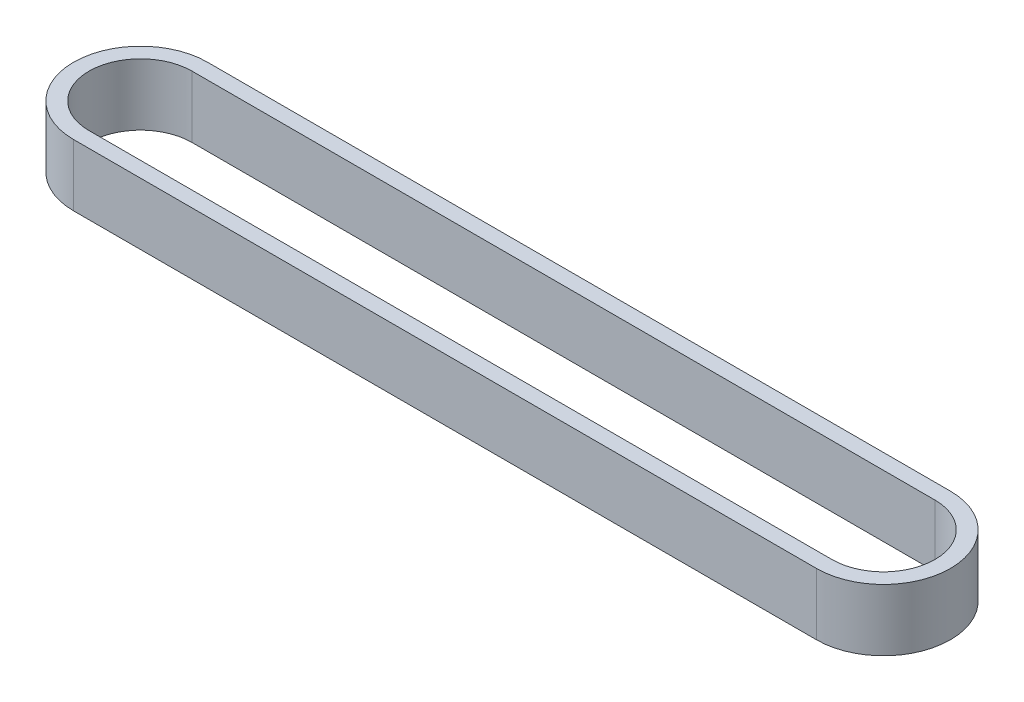
ISO-10303-21;
HEADER;
FILE_DESCRIPTION(('STEP AP214'),'2;1');
FILE_NAME('part.step','',(''),(''),'','','');
FILE_SCHEMA(('AUTOMOTIVE_DESIGN { 1 0 10303 214 1 1 1 1 }'));
ENDSEC;
DATA;
#1=APPLICATION_CONTEXT('core data for automotive mechanical design processes');
#2=APPLICATION_PROTOCOL_DEFINITION('international standard','automotive_design',2000,#1);
#3=PRODUCT_CONTEXT('',#1,'mechanical');
#4=PRODUCT('Part','Part','',(#3));
#5=PRODUCT_RELATED_PRODUCT_CATEGORY('part','',(#4));
#6=PRODUCT_DEFINITION_FORMATION('','',#4);
#7=PRODUCT_DEFINITION_CONTEXT('part definition',#1,'design');
#8=PRODUCT_DEFINITION('design','',#6,#7);
#9=PRODUCT_DEFINITION_SHAPE('','',#8);
#10=(LENGTH_UNIT() NAMED_UNIT(*) SI_UNIT(.MILLI.,.METRE.));
#11=(NAMED_UNIT(*) PLANE_ANGLE_UNIT() SI_UNIT($,.RADIAN.));
#12=(NAMED_UNIT(*) SI_UNIT($,.STERADIAN.) SOLID_ANGLE_UNIT());
#13=UNCERTAINTY_MEASURE_WITH_UNIT(LENGTH_MEASURE(1.E-05),#10,'distance_accuracy_value','');
#14=(GEOMETRIC_REPRESENTATION_CONTEXT(3) GLOBAL_UNCERTAINTY_ASSIGNED_CONTEXT((#13)) GLOBAL_UNIT_ASSIGNED_CONTEXT((#10,
#11,#12)) REPRESENTATION_CONTEXT('',''));
#15=CARTESIAN_POINT('',(0.,0.,0.));
#16=DIRECTION('',(0.,0.,1.));
#17=DIRECTION('',(1.,0.,0.));
#18=AXIS2_PLACEMENT_3D('',#15,#16,#17);
#19=CARTESIAN_POINT('',(0.,3.,0.));
#20=DIRECTION('',(0.,1.,0.));
#21=DIRECTION('',(0.,0.,1.));
#22=AXIS2_PLACEMENT_3D('',#19,#20,#21);
#23=PLANE('',#22);
#24=CARTESIAN_POINT('',(0.,3.,0.));
#25=DIRECTION('',(0.,1.,0.));
#26=DIRECTION('',(0.,0.,1.));
#27=AXIS2_PLACEMENT_3D('',#24,#25,#26);
#28=CIRCLE('',#27,6.49999999999999);
#29=CARTESIAN_POINT('',(0.,3.,-6.49999999999999));
#30=VERTEX_POINT('',#29);
#31=CARTESIAN_POINT('',(0.,3.,6.49999999999999));
#32=VERTEX_POINT('',#31);
#33=EDGE_CURVE('E153',#30,#32,#28,.T.);
#34=ORIENTED_EDGE('',*,*,#33,.T.);
#35=DIRECTION('',(1.,0.,0.));
#36=VECTOR('',#35,1.);
#37=CARTESIAN_POINT('',(72.12,3.,6.5));
#38=LINE('',#37,#36);
#39=CARTESIAN_POINT('',(72.12,3.,6.5));
#40=VERTEX_POINT('',#39);
#41=EDGE_CURVE('E157',#32,#40,#38,.T.);
#42=ORIENTED_EDGE('',*,*,#41,.T.);
#43=CARTESIAN_POINT('',(72.12,3.,0.));
#44=DIRECTION('',(0.,1.,0.));
#45=DIRECTION('',(0.,0.,-1.));
#46=AXIS2_PLACEMENT_3D('',#43,#44,#45);
#47=CIRCLE('',#46,6.5);
#48=CARTESIAN_POINT('',(72.12,3.,-6.5));
#49=VERTEX_POINT('',#48);
#50=EDGE_CURVE('E161',#40,#49,#47,.T.);
#51=ORIENTED_EDGE('',*,*,#50,.T.);
#52=DIRECTION('',(-1.,0.,0.));
#53=VECTOR('',#52,1.);
#54=CARTESIAN_POINT('',(0.,3.,-6.49999999999999));
#55=LINE('',#54,#53);
#56=EDGE_CURVE('E164',#49,#30,#55,.T.);
#57=ORIENTED_EDGE('',*,*,#56,.T.);
#58=EDGE_LOOP('',(#34,#42,#51,#57));
#59=FACE_BOUND('',#58,.T.);
#60=DIRECTION('',(1.,0.,0.));
#61=VECTOR('',#60,1.);
#62=CARTESIAN_POINT('',(72.12,3.,5.));
#63=LINE('',#62,#61);
#64=CARTESIAN_POINT('',(0.,3.,4.99999999999999));
#65=VERTEX_POINT('',#64);
#66=CARTESIAN_POINT('',(72.12,3.,5.));
#67=VERTEX_POINT('',#66);
#68=EDGE_CURVE('E114',#65,#67,#63,.T.);
#69=ORIENTED_EDGE('',*,*,#68,.F.);
#70=CARTESIAN_POINT('',(0.,3.,0.));
#71=DIRECTION('',(0.,1.,0.));
#72=DIRECTION('',(0.,0.,1.));
#73=AXIS2_PLACEMENT_3D('',#70,#71,#72);
#74=CIRCLE('',#73,4.99999999999999);
#75=CARTESIAN_POINT('',(0.,3.,-4.99999999999999));
#76=VERTEX_POINT('',#75);
#77=EDGE_CURVE('E105',#76,#65,#74,.T.);
#78=ORIENTED_EDGE('',*,*,#77,.F.);
#79=DIRECTION('',(-1.,0.,0.));
#80=VECTOR('',#79,1.);
#81=CARTESIAN_POINT('',(0.,3.,-4.99999999999999));
#82=LINE('',#81,#80);
#83=CARTESIAN_POINT('',(72.12,3.,-5.));
#84=VERTEX_POINT('',#83);
#85=EDGE_CURVE('E131',#84,#76,#82,.T.);
#86=ORIENTED_EDGE('',*,*,#85,.F.);
#87=CARTESIAN_POINT('',(72.12,3.,0.));
#88=DIRECTION('',(0.,1.,0.));
#89=DIRECTION('',(0.,0.,-1.));
#90=AXIS2_PLACEMENT_3D('',#87,#88,#89);
#91=CIRCLE('',#90,5.);
#92=EDGE_CURVE('E127',#67,#84,#91,.T.);
#93=ORIENTED_EDGE('',*,*,#92,.F.);
#94=EDGE_LOOP('',(#69,#78,#86,#93));
#95=FACE_BOUND('',#94,.T.);
#96=ADVANCED_FACE('F39',(#59,#95),#23,.T.);
#97=CARTESIAN_POINT('',(0.,-3.,0.));
#98=DIRECTION('',(0.,1.,0.));
#99=DIRECTION('',(0.,0.,1.));
#100=AXIS2_PLACEMENT_3D('',#97,#98,#99);
#101=PLANE('',#100);
#102=CARTESIAN_POINT('',(0.,-3.,0.));
#103=DIRECTION('',(0.,1.,0.));
#104=DIRECTION('',(0.,0.,1.));
#105=AXIS2_PLACEMENT_3D('',#102,#103,#104);
#106=CIRCLE('',#105,6.49999999999999);
#107=CARTESIAN_POINT('',(0.,-3.,-6.49999999999999));
#108=VERTEX_POINT('',#107);
#109=CARTESIAN_POINT('',(0.,-3.,6.49999999999999));
#110=VERTEX_POINT('',#109);
#111=EDGE_CURVE('E123',#108,#110,#106,.T.);
#112=ORIENTED_EDGE('',*,*,#111,.F.);
#113=DIRECTION('',(-1.,0.,0.));
#114=VECTOR('',#113,1.);
#115=CARTESIAN_POINT('',(0.,-3.,-6.49999999999999));
#116=LINE('',#115,#114);
#117=CARTESIAN_POINT('',(72.12,-3.,-6.5));
#118=VERTEX_POINT('',#117);
#119=EDGE_CURVE('E158',#118,#108,#116,.T.);
#120=ORIENTED_EDGE('',*,*,#119,.F.);
#121=CARTESIAN_POINT('',(72.12,-3.,0.));
#122=DIRECTION('',(0.,1.,0.));
#123=DIRECTION('',(0.,0.,-1.));
#124=AXIS2_PLACEMENT_3D('',#121,#122,#123);
#125=CIRCLE('',#124,6.5);
#126=CARTESIAN_POINT('',(72.12,-3.,6.5));
#127=VERTEX_POINT('',#126);
#128=EDGE_CURVE('E174',#127,#118,#125,.T.);
#129=ORIENTED_EDGE('',*,*,#128,.F.);
#130=DIRECTION('',(1.,0.,0.));
#131=VECTOR('',#130,1.);
#132=CARTESIAN_POINT('',(72.12,-3.,6.5));
#133=LINE('',#132,#131);
#134=EDGE_CURVE('E171',#110,#127,#133,.T.);
#135=ORIENTED_EDGE('',*,*,#134,.F.);
#136=EDGE_LOOP('',(#112,#120,#129,#135));
#137=FACE_BOUND('',#136,.T.);
#138=CARTESIAN_POINT('',(0.,-3.,0.));
#139=DIRECTION('',(0.,1.,0.));
#140=DIRECTION('',(0.,0.,1.));
#141=AXIS2_PLACEMENT_3D('',#138,#139,#140);
#142=CIRCLE('',#141,4.99999999999999);
#143=CARTESIAN_POINT('',(0.,-3.,-4.99999999999999));
#144=VERTEX_POINT('',#143);
#145=CARTESIAN_POINT('',(0.,-3.,4.99999999999999));
#146=VERTEX_POINT('',#145);
#147=EDGE_CURVE('E63',#144,#146,#142,.T.);
#148=ORIENTED_EDGE('',*,*,#147,.T.);
#149=DIRECTION('',(1.,0.,0.));
#150=VECTOR('',#149,1.);
#151=CARTESIAN_POINT('',(72.12,-3.,5.));
#152=LINE('',#151,#150);
#153=CARTESIAN_POINT('',(72.12,-3.,5.));
#154=VERTEX_POINT('',#153);
#155=EDGE_CURVE('E121',#146,#154,#152,.T.);
#156=ORIENTED_EDGE('',*,*,#155,.T.);
#157=CARTESIAN_POINT('',(72.12,-3.,0.));
#158=DIRECTION('',(0.,1.,0.));
#159=DIRECTION('',(0.,0.,-1.));
#160=AXIS2_PLACEMENT_3D('',#157,#158,#159);
#161=CIRCLE('',#160,5.);
#162=CARTESIAN_POINT('',(72.12,-3.,-5.));
#163=VERTEX_POINT('',#162);
#164=EDGE_CURVE('E140',#154,#163,#161,.T.);
#165=ORIENTED_EDGE('',*,*,#164,.T.);
#166=DIRECTION('',(-1.,0.,0.));
#167=VECTOR('',#166,1.);
#168=CARTESIAN_POINT('',(0.,-3.,-4.99999999999999));
#169=LINE('',#168,#167);
#170=EDGE_CURVE('E115',#163,#144,#169,.T.);
#171=ORIENTED_EDGE('',*,*,#170,.T.);
#172=EDGE_LOOP('',(#148,#156,#165,#171));
#173=FACE_BOUND('',#172,.T.);
#174=ADVANCED_FACE('F197',(#137,#173),#101,.F.);
#175=CARTESIAN_POINT('',(0.,3.,0.));
#176=DIRECTION('',(0.,-1.,0.));
#177=DIRECTION('',(0.,0.,-1.));
#178=AXIS2_PLACEMENT_3D('',#175,#176,#177);
#179=CYLINDRICAL_SURFACE('',#178,6.49999999999999);
#180=ORIENTED_EDGE('',*,*,#111,.T.);
#181=DIRECTION('',(0.,-1.,0.));
#182=VECTOR('',#181,1.);
#183=CARTESIAN_POINT('',(0.,3.,6.49999999999999));
#184=LINE('',#183,#182);
#185=EDGE_CURVE('E11',#32,#110,#184,.T.);
#186=ORIENTED_EDGE('',*,*,#185,.F.);
#187=ORIENTED_EDGE('',*,*,#33,.F.);
#188=DIRECTION('',(0.,-1.,0.));
#189=VECTOR('',#188,1.);
#190=CARTESIAN_POINT('',(0.,3.,-6.49999999999999));
#191=LINE('',#190,#189);
#192=EDGE_CURVE('E167',#30,#108,#191,.T.);
#193=ORIENTED_EDGE('',*,*,#192,.T.);
#194=EDGE_LOOP('',(#180,#186,#187,#193));
#195=FACE_BOUND('',#194,.T.);
#196=ADVANCED_FACE('F41',(#195),#179,.T.);
#197=CARTESIAN_POINT('',(72.12,3.,6.5));
#198=DIRECTION('',(0.,0.,-1.));
#199=DIRECTION('',(-1.,0.,0.));
#200=AXIS2_PLACEMENT_3D('',#197,#198,#199);
#201=PLANE('',#200);
#202=ORIENTED_EDGE('',*,*,#134,.T.);
#203=DIRECTION('',(0.,-1.,0.));
#204=VECTOR('',#203,1.);
#205=CARTESIAN_POINT('',(72.12,3.,6.5));
#206=LINE('',#205,#204);
#207=EDGE_CURVE('E48',#40,#127,#206,.T.);
#208=ORIENTED_EDGE('',*,*,#207,.F.);
#209=ORIENTED_EDGE('',*,*,#41,.F.);
#210=ORIENTED_EDGE('',*,*,#185,.T.);
#211=EDGE_LOOP('',(#202,#208,#209,#210));
#212=FACE_BOUND('',#211,.T.);
#213=ADVANCED_FACE('F207',(#212),#201,.F.);
#214=CARTESIAN_POINT('',(72.12,3.,0.));
#215=DIRECTION('',(0.,-1.,0.));
#216=DIRECTION('',(0.,0.,-1.));
#217=AXIS2_PLACEMENT_3D('',#214,#215,#216);
#218=CYLINDRICAL_SURFACE('',#217,6.5);
#219=ORIENTED_EDGE('',*,*,#128,.T.);
#220=DIRECTION('',(0.,-1.,0.));
#221=VECTOR('',#220,1.);
#222=CARTESIAN_POINT('',(72.12,3.,-6.5));
#223=LINE('',#222,#221);
#224=EDGE_CURVE('E182',#49,#118,#223,.T.);
#225=ORIENTED_EDGE('',*,*,#224,.F.);
#226=ORIENTED_EDGE('',*,*,#50,.F.);
#227=ORIENTED_EDGE('',*,*,#207,.T.);
#228=EDGE_LOOP('',(#219,#225,#226,#227));
#229=FACE_BOUND('',#228,.T.);
#230=ADVANCED_FACE('F191',(#229),#218,.T.);
#231=CARTESIAN_POINT('',(0.,3.,-6.49999999999999));
#232=DIRECTION('',(0.,0.,1.));
#233=DIRECTION('',(1.,0.,0.));
#234=AXIS2_PLACEMENT_3D('',#231,#232,#233);
#235=PLANE('',#234);
#236=ORIENTED_EDGE('',*,*,#119,.T.);
#237=ORIENTED_EDGE('',*,*,#192,.F.);
#238=ORIENTED_EDGE('',*,*,#56,.F.);
#239=ORIENTED_EDGE('',*,*,#224,.T.);
#240=EDGE_LOOP('',(#236,#237,#238,#239));
#241=FACE_BOUND('',#240,.T.);
#242=ADVANCED_FACE('F201',(#241),#235,.F.);
#243=CARTESIAN_POINT('',(0.,3.,0.));
#244=DIRECTION('',(0.,-1.,0.));
#245=DIRECTION('',(0.,0.,-1.));
#246=AXIS2_PLACEMENT_3D('',#243,#244,#245);
#247=CYLINDRICAL_SURFACE('',#246,4.99999999999999);
#248=ORIENTED_EDGE('',*,*,#147,.F.);
#249=DIRECTION('',(0.,-1.,0.));
#250=VECTOR('',#249,1.);
#251=CARTESIAN_POINT('',(0.,3.,-4.99999999999999));
#252=LINE('',#251,#250);
#253=EDGE_CURVE('E109',#76,#144,#252,.T.);
#254=ORIENTED_EDGE('',*,*,#253,.F.);
#255=ORIENTED_EDGE('',*,*,#77,.T.);
#256=DIRECTION('',(0.,-1.,0.));
#257=VECTOR('',#256,1.);
#258=CARTESIAN_POINT('',(0.,3.,4.99999999999999));
#259=LINE('',#258,#257);
#260=EDGE_CURVE('E108',#65,#146,#259,.T.);
#261=ORIENTED_EDGE('',*,*,#260,.T.);
#262=EDGE_LOOP('',(#248,#254,#255,#261));
#263=FACE_BOUND('',#262,.T.);
#264=ADVANCED_FACE('F107',(#263),#247,.F.);
#265=CARTESIAN_POINT('',(72.12,3.,5.));
#266=DIRECTION('',(0.,0.,-1.));
#267=DIRECTION('',(-1.,0.,0.));
#268=AXIS2_PLACEMENT_3D('',#265,#266,#267);
#269=PLANE('',#268);
#270=ORIENTED_EDGE('',*,*,#155,.F.);
#271=ORIENTED_EDGE('',*,*,#260,.F.);
#272=ORIENTED_EDGE('',*,*,#68,.T.);
#273=DIRECTION('',(0.,-1.,0.));
#274=VECTOR('',#273,1.);
#275=CARTESIAN_POINT('',(72.12,3.,5.));
#276=LINE('',#275,#274);
#277=EDGE_CURVE('E124',#67,#154,#276,.T.);
#278=ORIENTED_EDGE('',*,*,#277,.T.);
#279=EDGE_LOOP('',(#270,#271,#272,#278));
#280=FACE_BOUND('',#279,.T.);
#281=ADVANCED_FACE('F118',(#280),#269,.T.);
#282=CARTESIAN_POINT('',(72.12,3.,0.));
#283=DIRECTION('',(0.,-1.,0.));
#284=DIRECTION('',(0.,0.,-1.));
#285=AXIS2_PLACEMENT_3D('',#282,#283,#284);
#286=CYLINDRICAL_SURFACE('',#285,5.);
#287=ORIENTED_EDGE('',*,*,#164,.F.);
#288=ORIENTED_EDGE('',*,*,#277,.F.);
#289=ORIENTED_EDGE('',*,*,#92,.T.);
#290=DIRECTION('',(0.,-1.,0.));
#291=VECTOR('',#290,1.);
#292=CARTESIAN_POINT('',(72.12,3.,-5.));
#293=LINE('',#292,#291);
#294=EDGE_CURVE('E55',#84,#163,#293,.T.);
#295=ORIENTED_EDGE('',*,*,#294,.T.);
#296=EDGE_LOOP('',(#287,#288,#289,#295));
#297=FACE_BOUND('',#296,.T.);
#298=ADVANCED_FACE('F230',(#297),#286,.F.);
#299=CARTESIAN_POINT('',(0.,3.,-4.99999999999999));
#300=DIRECTION('',(0.,0.,1.));
#301=DIRECTION('',(1.,0.,0.));
#302=AXIS2_PLACEMENT_3D('',#299,#300,#301);
#303=PLANE('',#302);
#304=ORIENTED_EDGE('',*,*,#170,.F.);
#305=ORIENTED_EDGE('',*,*,#294,.F.);
#306=ORIENTED_EDGE('',*,*,#85,.T.);
#307=ORIENTED_EDGE('',*,*,#253,.T.);
#308=EDGE_LOOP('',(#304,#305,#306,#307));
#309=FACE_BOUND('',#308,.T.);
#310=ADVANCED_FACE('F234',(#309),#303,.T.);
#311=CLOSED_SHELL('',(#96,#174,#196,#213,#230,#242,#264,#281,#298,#310));
#312=MANIFOLD_SOLID_BREP('B2',#311);
#313=ADVANCED_BREP_SHAPE_REPRESENTATION('',(#18,#312),#14);
#314=SHAPE_DEFINITION_REPRESENTATION(#9,#313);
ENDSEC;
END-ISO-10303-21;
